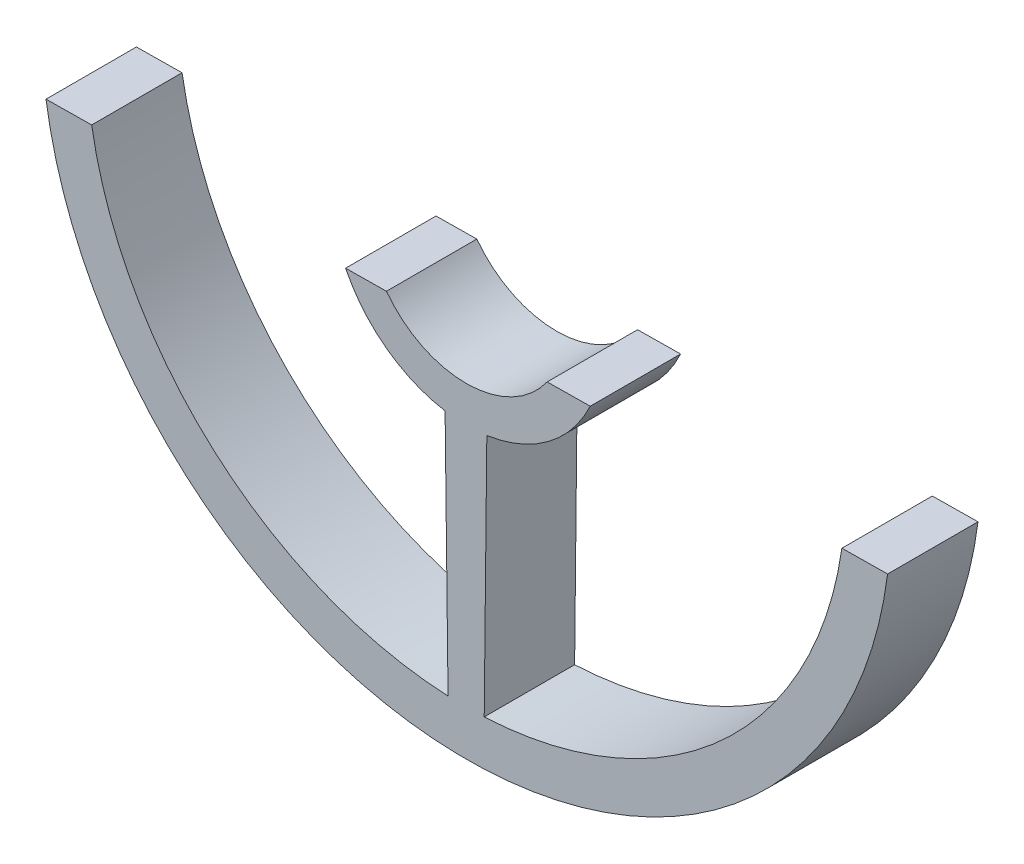
ISO-10303-21;
HEADER;
FILE_DESCRIPTION(('STEP AP214'),'2;1');
FILE_NAME('part.step','',(''),(''),'','','');
FILE_SCHEMA(('AUTOMOTIVE_DESIGN { 1 0 10303 214 1 1 1 1 }'));
ENDSEC;
DATA;
#1=APPLICATION_CONTEXT('core data for automotive mechanical design processes');
#2=APPLICATION_PROTOCOL_DEFINITION('international standard','automotive_design',2000,#1);
#3=PRODUCT_CONTEXT('',#1,'mechanical');
#4=PRODUCT('Part','Part','',(#3));
#5=PRODUCT_RELATED_PRODUCT_CATEGORY('part','',(#4));
#6=PRODUCT_DEFINITION_FORMATION('','',#4);
#7=PRODUCT_DEFINITION_CONTEXT('part definition',#1,'design');
#8=PRODUCT_DEFINITION('design','',#6,#7);
#9=PRODUCT_DEFINITION_SHAPE('','',#8);
#10=(LENGTH_UNIT() NAMED_UNIT(*) SI_UNIT(.MILLI.,.METRE.));
#11=(NAMED_UNIT(*) PLANE_ANGLE_UNIT() SI_UNIT($,.RADIAN.));
#12=(NAMED_UNIT(*) SI_UNIT($,.STERADIAN.) SOLID_ANGLE_UNIT());
#13=UNCERTAINTY_MEASURE_WITH_UNIT(LENGTH_MEASURE(1.E-05),#10,'distance_accuracy_value','');
#14=(GEOMETRIC_REPRESENTATION_CONTEXT(3) GLOBAL_UNCERTAINTY_ASSIGNED_CONTEXT((#13)) GLOBAL_UNIT_ASSIGNED_CONTEXT((#10,
#11,#12)) REPRESENTATION_CONTEXT('',''));
#15=CARTESIAN_POINT('',(0.,0.,0.));
#16=DIRECTION('',(0.,0.,1.));
#17=DIRECTION('',(1.,0.,0.));
#18=AXIS2_PLACEMENT_3D('',#15,#16,#17);
#19=CARTESIAN_POINT('',(0.0468573557127806,-4.11311577984681,0.));
#20=DIRECTION('',(-0.0113914409176292,0.999935115431907,0.));
#21=DIRECTION('',(-0.999935115431907,-0.0113914409176292,0.));
#22=AXIS2_PLACEMENT_3D('',#19,#20,#21);
#23=PLANE('',#22);
#24=DIRECTION('',(0.,0.,-1.));
#25=VECTOR('',#24,1.);
#26=CARTESIAN_POINT('',(29.6051170954915,-3.77638276161673,165.1));
#27=LINE('',#26,#25);
#28=CARTESIAN_POINT('',(29.6051170954915,-3.77638276161673,6.35));
#29=VERTEX_POINT('',#28);
#30=CARTESIAN_POINT('',(29.6051170954915,-3.77638276161673,0.));
#31=VERTEX_POINT('',#30);
#32=EDGE_CURVE('E178',#29,#31,#27,.T.);
#33=ORIENTED_EDGE('',*,*,#32,.T.);
#34=DIRECTION('',(-0.999935115431907,-0.0113914409176292,0.));
#35=VECTOR('',#34,1.);
#36=CARTESIAN_POINT('',(0.0468573557127806,-4.11311577984681,0.));
#37=LINE('',#36,#35);
#38=CARTESIAN_POINT('',(26.3960296051398,-3.81294126424523,0.));
#39=VERTEX_POINT('',#38);
#40=EDGE_CURVE('E184',#31,#39,#37,.T.);
#41=ORIENTED_EDGE('',*,*,#40,.T.);
#42=DIRECTION('',(0.,0.,-1.));
#43=VECTOR('',#42,1.);
#44=CARTESIAN_POINT('',(26.3960296051398,-3.81294126424523,6.35));
#45=LINE('',#44,#43);
#46=CARTESIAN_POINT('',(26.3960296051398,-3.81294126424523,6.35));
#47=VERTEX_POINT('',#46);
#48=EDGE_CURVE('E166',#39,#47,#45,.F.);
#49=ORIENTED_EDGE('',*,*,#48,.T.);
#50=DIRECTION('',(0.999935115431907,0.0113914409176292,0.));
#51=VECTOR('',#50,1.);
#52=CARTESIAN_POINT('',(0.0468573557127806,-4.11311577984681,6.35));
#53=LINE('',#52,#51);
#54=EDGE_CURVE('E157',#47,#29,#53,.T.);
#55=ORIENTED_EDGE('',*,*,#54,.T.);
#56=EDGE_LOOP('',(#33,#41,#49,#55));
#57=FACE_BOUND('',#56,.T.);
#58=ADVANCED_FACE('F35',(#57),#23,.T.);
#59=DIRECTION('',(0.,0.,-1.));
#60=VECTOR('',#59,1.);
#61=CARTESIAN_POINT('',(-26.3023148937142,-4.41329029544839,6.35));
#62=LINE('',#61,#60);
#63=CARTESIAN_POINT('',(-26.3023148937142,-4.41329029544839,6.35));
#64=VERTEX_POINT('',#63);
#65=CARTESIAN_POINT('',(-26.3023148937142,-4.41329029544839,0.));
#66=VERTEX_POINT('',#65);
#67=EDGE_CURVE('E163',#64,#66,#62,.T.);
#68=ORIENTED_EDGE('',*,*,#67,.T.);
#69=CARTESIAN_POINT('',(-29.511402384066,-4.44984879807689,0.));
#70=VERTEX_POINT('',#69);
#71=EDGE_CURVE('E181',#66,#70,#37,.T.);
#72=ORIENTED_EDGE('',*,*,#71,.T.);
#73=DIRECTION('',(0.,0.,-1.));
#74=VECTOR('',#73,1.);
#75=CARTESIAN_POINT('',(-29.511402384066,-4.44984879807689,165.1));
#76=LINE('',#75,#74);
#77=CARTESIAN_POINT('',(-29.511402384066,-4.44984879807689,6.35));
#78=VERTEX_POINT('',#77);
#79=EDGE_CURVE('E175',#70,#78,#76,.F.);
#80=ORIENTED_EDGE('',*,*,#79,.T.);
#81=EDGE_CURVE('E174',#78,#64,#53,.T.);
#82=ORIENTED_EDGE('',*,*,#81,.T.);
#83=EDGE_LOOP('',(#68,#72,#80,#82));
#84=FACE_BOUND('',#83,.T.);
#85=ADVANCED_FACE('F239',(#84),#23,.T.);
#86=DIRECTION('',(0.,0.,-1.));
#87=VECTOR('',#86,1.);
#88=CARTESIAN_POINT('',(-8.46666643931685,-4.21010337615702,6.35));
#89=LINE('',#88,#87);
#90=CARTESIAN_POINT('',(-8.46666643931685,-4.21010337615702,6.35));
#91=VERTEX_POINT('',#90);
#92=CARTESIAN_POINT('',(-8.46666643931685,-4.21010337615702,0.));
#93=VERTEX_POINT('',#92);
#94=EDGE_CURVE('E185',#91,#93,#89,.T.);
#95=ORIENTED_EDGE('',*,*,#94,.F.);
#96=CARTESIAN_POINT('',(-5.59815569313217,-4.17742478513401,6.35));
#97=VERTEX_POINT('',#96);
#98=EDGE_CURVE('E156',#91,#97,#53,.T.);
#99=ORIENTED_EDGE('',*,*,#98,.T.);
#100=DIRECTION('',(0.,0.,-1.));
#101=VECTOR('',#100,1.);
#102=CARTESIAN_POINT('',(-5.59815569313217,-4.17742478513401,6.35));
#103=LINE('',#102,#101);
#104=CARTESIAN_POINT('',(-5.59815569313217,-4.17742478513401,0.));
#105=VERTEX_POINT('',#104);
#106=EDGE_CURVE('E141',#97,#105,#103,.T.);
#107=ORIENTED_EDGE('',*,*,#106,.T.);
#108=EDGE_CURVE('E183',#105,#93,#37,.T.);
#109=ORIENTED_EDGE('',*,*,#108,.T.);
#110=EDGE_LOOP('',(#95,#99,#107,#109));
#111=FACE_BOUND('',#110,.T.);
#112=ADVANCED_FACE('F194',(#111),#23,.T.);
#113=CARTESIAN_POINT('',(8.71511229198681,-4.01436545850935,0.));
#114=VERTEX_POINT('',#113);
#115=CARTESIAN_POINT('',(5.69187040455773,-4.04880677455961,0.));
#116=VERTEX_POINT('',#115);
#117=EDGE_CURVE('E162',#114,#116,#37,.T.);
#118=ORIENTED_EDGE('',*,*,#117,.T.);
#119=DIRECTION('',(0.,0.,-1.));
#120=VECTOR('',#119,1.);
#121=CARTESIAN_POINT('',(5.69187040455773,-4.04880677455961,6.35));
#122=LINE('',#121,#120);
#123=CARTESIAN_POINT('',(5.69187040455773,-4.04880677455961,6.35));
#124=VERTEX_POINT('',#123);
#125=EDGE_CURVE('E139',#116,#124,#122,.F.);
#126=ORIENTED_EDGE('',*,*,#125,.T.);
#127=CARTESIAN_POINT('',(8.71511229198681,-4.01436545850935,6.35));
#128=VERTEX_POINT('',#127);
#129=EDGE_CURVE('E150',#124,#128,#53,.T.);
#130=ORIENTED_EDGE('',*,*,#129,.T.);
#131=DIRECTION('',(0.,0.,-1.));
#132=VECTOR('',#131,1.);
#133=CARTESIAN_POINT('',(8.71511229198681,-4.01436545850935,6.35));
#134=LINE('',#133,#132);
#135=EDGE_CURVE('E39',#114,#128,#134,.F.);
#136=ORIENTED_EDGE('',*,*,#135,.F.);
#137=EDGE_LOOP('',(#118,#126,#130,#136));
#138=FACE_BOUND('',#137,.T.);
#139=ADVANCED_FACE('F160',(#138),#23,.T.);
#140=CARTESIAN_POINT('',(0.,0.,0.));
#141=DIRECTION('',(0.,0.,1.));
#142=DIRECTION('',(1.,0.,0.));
#143=AXIS2_PLACEMENT_3D('',#140,#141,#142);
#144=PLANE('',#143);
#145=ORIENTED_EDGE('',*,*,#40,.F.);
#146=CARTESIAN_POINT('',(0.,0.,0.));
#147=DIRECTION('',(0.,0.,1.));
#148=DIRECTION('',(1.,0.,0.));
#149=AXIS2_PLACEMENT_3D('',#146,#147,#148);
#150=CIRCLE('',#149,29.845);
#151=EDGE_CURVE('E187',#70,#31,#150,.T.);
#152=ORIENTED_EDGE('',*,*,#151,.F.);
#153=ORIENTED_EDGE('',*,*,#71,.F.);
#154=CARTESIAN_POINT('',(0.,0.,0.));
#155=DIRECTION('',(0.,0.,-1.));
#156=DIRECTION('',(-1.,0.,0.));
#157=AXIS2_PLACEMENT_3D('',#154,#155,#156);
#158=CIRCLE('',#157,26.67);
#159=CARTESIAN_POINT('',(-1.27,-26.6397447435218,0.));
#160=VERTEX_POINT('',#159);
#161=EDGE_CURVE('E198',#160,#66,#158,.T.);
#162=ORIENTED_EDGE('',*,*,#161,.F.);
#163=DIRECTION('',(0.0120211022943788,-0.999927743939345,0.));
#164=VECTOR('',#163,1.);
#165=CARTESIAN_POINT('',(-1.59003243367895,-0.019115323734626,0.));
#166=LINE('',#165,#164);
#167=CARTESIAN_POINT('',(-1.47728855557888,-9.39726791830151,0.));
#168=VERTEX_POINT('',#167);
#169=EDGE_CURVE('E45',#168,#160,#166,.T.);
#170=ORIENTED_EDGE('',*,*,#169,.F.);
#171=CARTESIAN_POINT('',(0.0773756112626845,0.,0.));
#172=DIRECTION('',(0.,0.,-1.));
#173=DIRECTION('',(-1.,0.,0.));
#174=AXIS2_PLACEMENT_3D('',#171,#172,#173);
#175=CIRCLE('',#174,9.525);
#176=EDGE_CURVE('E196',#168,#93,#175,.T.);
#177=ORIENTED_EDGE('',*,*,#176,.T.);
#178=ORIENTED_EDGE('',*,*,#108,.F.);
#179=CARTESIAN_POINT('',(0.,0.,0.));
#180=DIRECTION('',(0.,0.,-1.));
#181=DIRECTION('',(-1.,0.,0.));
#182=AXIS2_PLACEMENT_3D('',#179,#180,#181);
#183=CIRCLE('',#182,6.985);
#184=EDGE_CURVE('E11',#116,#105,#183,.T.);
#185=ORIENTED_EDGE('',*,*,#184,.F.);
#186=ORIENTED_EDGE('',*,*,#117,.F.);
#187=CARTESIAN_POINT('',(0.0773756112626845,0.,0.));
#188=DIRECTION('',(0.,0.,-1.));
#189=DIRECTION('',(-1.,0.,0.));
#190=AXIS2_PLACEMENT_3D('',#187,#188,#189);
#191=CIRCLE('',#190,9.525);
#192=CARTESIAN_POINT('',(1.45348067519036,-9.42507081421846,0.));
#193=VERTEX_POINT('',#192);
#194=EDGE_CURVE('E201',#114,#193,#191,.T.);
#195=ORIENTED_EDGE('',*,*,#194,.T.);
#196=DIRECTION('',(0.0106577827158343,0.999943204220911,0.));
#197=VECTOR('',#196,1.);
#198=CARTESIAN_POINT('',(1.55376022840728,-0.0165605794778835,0.));
#199=LINE('',#198,#197);
#200=CARTESIAN_POINT('',(1.27000000000001,-26.6397447435218,0.));
#201=VERTEX_POINT('',#200);
#202=EDGE_CURVE('E206',#201,#193,#199,.T.);
#203=ORIENTED_EDGE('',*,*,#202,.F.);
#204=CARTESIAN_POINT('',(0.,0.,0.));
#205=DIRECTION('',(0.,0.,-1.));
#206=DIRECTION('',(-1.,0.,0.));
#207=AXIS2_PLACEMENT_3D('',#204,#205,#206);
#208=CIRCLE('',#207,26.67);
#209=EDGE_CURVE('E85',#39,#201,#208,.T.);
#210=ORIENTED_EDGE('',*,*,#209,.F.);
#211=EDGE_LOOP('',(#145,#152,#153,#162,#170,#177,#178,#185,#186,#195,#203,#210));
#212=FACE_BOUND('',#211,.T.);
#213=ADVANCED_FACE('F197',(#212),#144,.F.);
#214=CARTESIAN_POINT('',(0.,0.,165.1));
#215=DIRECTION('',(0.,0.,-1.));
#216=DIRECTION('',(-1.,0.,0.));
#217=AXIS2_PLACEMENT_3D('',#214,#215,#216);
#218=CYLINDRICAL_SURFACE('',#217,29.845);
#219=ORIENTED_EDGE('',*,*,#32,.F.);
#220=CARTESIAN_POINT('',(0.,0.,6.35));
#221=DIRECTION('',(0.,0.,-1.));
#222=DIRECTION('',(-1.,0.,0.));
#223=AXIS2_PLACEMENT_3D('',#220,#221,#222);
#224=CIRCLE('',#223,29.845);
#225=EDGE_CURVE('E145',#29,#78,#224,.T.);
#226=ORIENTED_EDGE('',*,*,#225,.T.);
#227=ORIENTED_EDGE('',*,*,#79,.F.);
#228=ORIENTED_EDGE('',*,*,#151,.T.);
#229=EDGE_LOOP('',(#219,#226,#227,#228));
#230=FACE_BOUND('',#229,.T.);
#231=ADVANCED_FACE('F250',(#230),#218,.T.);
#232=CARTESIAN_POINT('',(0.,0.,6.35));
#233=DIRECTION('',(0.,0.,-1.));
#234=DIRECTION('',(-1.,0.,0.));
#235=AXIS2_PLACEMENT_3D('',#232,#233,#234);
#236=PLANE('',#235);
#237=ORIENTED_EDGE('',*,*,#81,.F.);
#238=ORIENTED_EDGE('',*,*,#225,.F.);
#239=ORIENTED_EDGE('',*,*,#54,.F.);
#240=CARTESIAN_POINT('',(0.,0.,6.35));
#241=DIRECTION('',(0.,0.,-1.));
#242=DIRECTION('',(-1.,0.,0.));
#243=AXIS2_PLACEMENT_3D('',#240,#241,#242);
#244=CIRCLE('',#243,26.67);
#245=CARTESIAN_POINT('',(1.27000000000001,-26.6397447435218,6.35));
#246=VERTEX_POINT('',#245);
#247=EDGE_CURVE('E214',#47,#246,#244,.T.);
#248=ORIENTED_EDGE('',*,*,#247,.T.);
#249=DIRECTION('',(0.0106577827158343,0.999943204220911,0.));
#250=VECTOR('',#249,1.);
#251=CARTESIAN_POINT('',(1.55376022840728,-0.0165605794778835,6.35));
#252=LINE('',#251,#250);
#253=CARTESIAN_POINT('',(1.45348067519036,-9.42507081421846,6.35));
#254=VERTEX_POINT('',#253);
#255=EDGE_CURVE('E213',#246,#254,#252,.T.);
#256=ORIENTED_EDGE('',*,*,#255,.T.);
#257=CARTESIAN_POINT('',(0.0773756112626845,0.,6.35));
#258=DIRECTION('',(0.,0.,-1.));
#259=DIRECTION('',(-1.,0.,0.));
#260=AXIS2_PLACEMENT_3D('',#257,#258,#259);
#261=CIRCLE('',#260,9.525);
#262=EDGE_CURVE('E154',#128,#254,#261,.T.);
#263=ORIENTED_EDGE('',*,*,#262,.F.);
#264=ORIENTED_EDGE('',*,*,#129,.F.);
#265=CARTESIAN_POINT('',(0.,0.,6.35));
#266=DIRECTION('',(0.,0.,-1.));
#267=DIRECTION('',(-1.,0.,0.));
#268=AXIS2_PLACEMENT_3D('',#265,#266,#267);
#269=CIRCLE('',#268,6.985);
#270=EDGE_CURVE('E135',#124,#97,#269,.T.);
#271=ORIENTED_EDGE('',*,*,#270,.T.);
#272=ORIENTED_EDGE('',*,*,#98,.F.);
#273=CARTESIAN_POINT('',(0.0773756112626845,0.,6.35));
#274=DIRECTION('',(0.,0.,-1.));
#275=DIRECTION('',(-1.,0.,0.));
#276=AXIS2_PLACEMENT_3D('',#273,#274,#275);
#277=CIRCLE('',#276,9.525);
#278=CARTESIAN_POINT('',(-1.47728855557888,-9.39726791830151,6.35));
#279=VERTEX_POINT('',#278);
#280=EDGE_CURVE('E209',#279,#91,#277,.T.);
#281=ORIENTED_EDGE('',*,*,#280,.F.);
#282=DIRECTION('',(0.0120211022943788,-0.999927743939345,0.));
#283=VECTOR('',#282,1.);
#284=CARTESIAN_POINT('',(-1.59003243367895,-0.019115323734626,6.35));
#285=LINE('',#284,#283);
#286=CARTESIAN_POINT('',(-1.27,-26.6397447435218,6.35));
#287=VERTEX_POINT('',#286);
#288=EDGE_CURVE('E146',#279,#287,#285,.T.);
#289=ORIENTED_EDGE('',*,*,#288,.T.);
#290=CARTESIAN_POINT('',(0.,0.,6.35));
#291=DIRECTION('',(0.,0.,-1.));
#292=DIRECTION('',(-1.,0.,0.));
#293=AXIS2_PLACEMENT_3D('',#290,#291,#292);
#294=CIRCLE('',#293,26.67);
#295=EDGE_CURVE('E73',#287,#64,#294,.T.);
#296=ORIENTED_EDGE('',*,*,#295,.T.);
#297=EDGE_LOOP('',(#237,#238,#239,#248,#256,#263,#264,#271,#272,#281,#289,#296));
#298=FACE_BOUND('',#297,.T.);
#299=ADVANCED_FACE('F152',(#298),#236,.F.);
#300=CARTESIAN_POINT('',(0.,0.,6.35));
#301=DIRECTION('',(0.,0.,-1.));
#302=DIRECTION('',(-1.,0.,0.));
#303=AXIS2_PLACEMENT_3D('',#300,#301,#302);
#304=CYLINDRICAL_SURFACE('',#303,26.67);
#305=ORIENTED_EDGE('',*,*,#48,.F.);
#306=ORIENTED_EDGE('',*,*,#209,.T.);
#307=DIRECTION('',(0.,0.,-1.));
#308=VECTOR('',#307,1.);
#309=CARTESIAN_POINT('',(1.27000000000001,-26.6397447435218,6.35));
#310=LINE('',#309,#308);
#311=EDGE_CURVE('E215',#246,#201,#310,.T.);
#312=ORIENTED_EDGE('',*,*,#311,.F.);
#313=ORIENTED_EDGE('',*,*,#247,.F.);
#314=EDGE_LOOP('',(#305,#306,#312,#313));
#315=FACE_BOUND('',#314,.T.);
#316=ADVANCED_FACE('F37',(#315),#304,.F.);
#317=CARTESIAN_POINT('',(0.,0.,6.35));
#318=DIRECTION('',(0.,0.,-1.));
#319=DIRECTION('',(-1.,0.,0.));
#320=AXIS2_PLACEMENT_3D('',#317,#318,#319);
#321=CYLINDRICAL_SURFACE('',#320,26.67);
#322=ORIENTED_EDGE('',*,*,#67,.F.);
#323=ORIENTED_EDGE('',*,*,#295,.F.);
#324=DIRECTION('',(0.,0.,-1.));
#325=VECTOR('',#324,1.);
#326=CARTESIAN_POINT('',(-1.27,-26.6397447435218,6.35));
#327=LINE('',#326,#325);
#328=EDGE_CURVE('E226',#287,#160,#327,.T.);
#329=ORIENTED_EDGE('',*,*,#328,.T.);
#330=ORIENTED_EDGE('',*,*,#161,.T.);
#331=EDGE_LOOP('',(#322,#323,#329,#330));
#332=FACE_BOUND('',#331,.T.);
#333=ADVANCED_FACE('F236',(#332),#321,.F.);
#334=CARTESIAN_POINT('',(0.0773756112626845,0.,6.35));
#335=DIRECTION('',(0.,0.,-1.));
#336=DIRECTION('',(-1.,0.,0.));
#337=AXIS2_PLACEMENT_3D('',#334,#335,#336);
#338=CYLINDRICAL_SURFACE('',#337,9.525);
#339=ORIENTED_EDGE('',*,*,#280,.T.);
#340=ORIENTED_EDGE('',*,*,#94,.T.);
#341=ORIENTED_EDGE('',*,*,#176,.F.);
#342=DIRECTION('',(0.,0.,-1.));
#343=VECTOR('',#342,1.);
#344=CARTESIAN_POINT('',(-1.47728855557888,-9.39726791830151,6.35));
#345=LINE('',#344,#343);
#346=EDGE_CURVE('E54',#279,#168,#345,.T.);
#347=ORIENTED_EDGE('',*,*,#346,.F.);
#348=EDGE_LOOP('',(#339,#340,#341,#347));
#349=FACE_BOUND('',#348,.T.);
#350=ADVANCED_FACE('F240',(#349),#338,.T.);
#351=CARTESIAN_POINT('',(0.,0.,6.35));
#352=DIRECTION('',(0.,0.,-1.));
#353=DIRECTION('',(-1.,0.,0.));
#354=AXIS2_PLACEMENT_3D('',#351,#352,#353);
#355=CYLINDRICAL_SURFACE('',#354,6.985);
#356=ORIENTED_EDGE('',*,*,#125,.F.);
#357=ORIENTED_EDGE('',*,*,#184,.T.);
#358=ORIENTED_EDGE('',*,*,#106,.F.);
#359=ORIENTED_EDGE('',*,*,#270,.F.);
#360=EDGE_LOOP('',(#356,#357,#358,#359));
#361=FACE_BOUND('',#360,.T.);
#362=ADVANCED_FACE('F137',(#361),#355,.F.);
#363=CARTESIAN_POINT('',(0.0773756112626845,0.,6.35));
#364=DIRECTION('',(0.,0.,-1.));
#365=DIRECTION('',(-1.,0.,0.));
#366=AXIS2_PLACEMENT_3D('',#363,#364,#365);
#367=CYLINDRICAL_SURFACE('',#366,9.525);
#368=ORIENTED_EDGE('',*,*,#194,.F.);
#369=ORIENTED_EDGE('',*,*,#135,.T.);
#370=ORIENTED_EDGE('',*,*,#262,.T.);
#371=DIRECTION('',(0.,0.,-1.));
#372=VECTOR('',#371,1.);
#373=CARTESIAN_POINT('',(1.45348067519036,-9.42507081421846,6.35));
#374=LINE('',#373,#372);
#375=EDGE_CURVE('E219',#254,#193,#374,.T.);
#376=ORIENTED_EDGE('',*,*,#375,.T.);
#377=EDGE_LOOP('',(#368,#369,#370,#376));
#378=FACE_BOUND('',#377,.T.);
#379=ADVANCED_FACE('F247',(#378),#367,.T.);
#380=CARTESIAN_POINT('',(1.55376022840728,-0.0165605794778835,6.35));
#381=DIRECTION('',(-0.999943204220911,0.0106577827158343,0.));
#382=DIRECTION('',(-0.0106577827158343,-0.999943204220911,0.));
#383=AXIS2_PLACEMENT_3D('',#380,#381,#382);
#384=PLANE('',#383);
#385=ORIENTED_EDGE('',*,*,#202,.T.);
#386=ORIENTED_EDGE('',*,*,#375,.F.);
#387=ORIENTED_EDGE('',*,*,#255,.F.);
#388=ORIENTED_EDGE('',*,*,#311,.T.);
#389=EDGE_LOOP('',(#385,#386,#387,#388));
#390=FACE_BOUND('',#389,.T.);
#391=ADVANCED_FACE('F261',(#390),#384,.F.);
#392=CARTESIAN_POINT('',(-1.59003243367895,-0.019115323734626,6.35));
#393=DIRECTION('',(0.999927743939345,0.0120211022943788,0.));
#394=DIRECTION('',(-0.0120211022943788,0.999927743939345,0.));
#395=AXIS2_PLACEMENT_3D('',#392,#393,#394);
#396=PLANE('',#395);
#397=ORIENTED_EDGE('',*,*,#169,.T.);
#398=ORIENTED_EDGE('',*,*,#328,.F.);
#399=ORIENTED_EDGE('',*,*,#288,.F.);
#400=ORIENTED_EDGE('',*,*,#346,.T.);
#401=EDGE_LOOP('',(#397,#398,#399,#400));
#402=FACE_BOUND('',#401,.T.);
#403=ADVANCED_FACE('F234',(#402),#396,.F.);
#404=CLOSED_SHELL('',(#58,#85,#112,#139,#213,#231,#299,#316,#333,#350,#362,#379,#391,#403));
#405=MANIFOLD_SOLID_BREP('B2',#404);
#406=ADVANCED_BREP_SHAPE_REPRESENTATION('',(#18,#405),#14);
#407=SHAPE_DEFINITION_REPRESENTATION(#9,#406);
ENDSEC;
END-ISO-10303-21;
